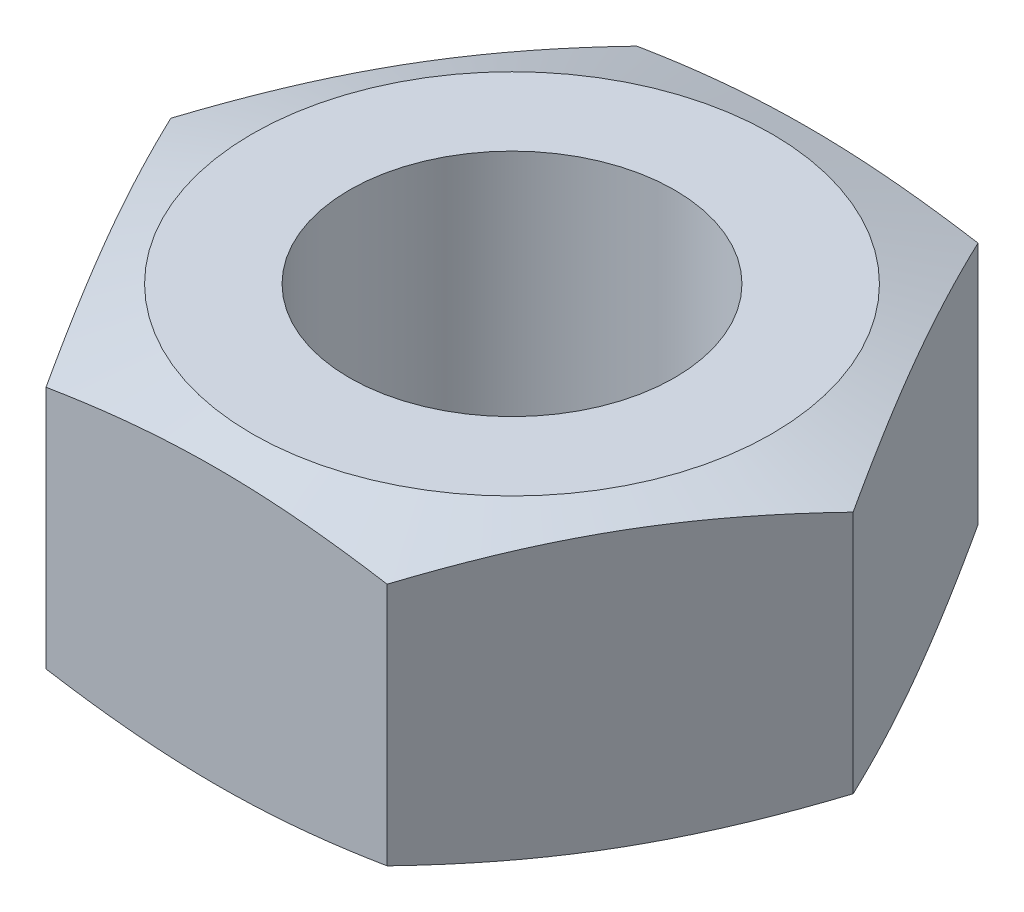
ISO-10303-21;
HEADER;
FILE_DESCRIPTION(('STEP AP214'),'2;1');
FILE_NAME('part.step','',(''),(''),'','','');
FILE_SCHEMA(('AUTOMOTIVE_DESIGN { 1 0 10303 214 1 1 1 1 }'));
ENDSEC;
DATA;
#1=APPLICATION_CONTEXT('core data for automotive mechanical design processes');
#2=APPLICATION_PROTOCOL_DEFINITION('international standard','automotive_design',2000,#1);
#3=PRODUCT_CONTEXT('',#1,'mechanical');
#4=PRODUCT('Part','Part','',(#3));
#5=PRODUCT_RELATED_PRODUCT_CATEGORY('part','',(#4));
#6=PRODUCT_DEFINITION_FORMATION('','',#4);
#7=PRODUCT_DEFINITION_CONTEXT('part definition',#1,'design');
#8=PRODUCT_DEFINITION('design','',#6,#7);
#9=PRODUCT_DEFINITION_SHAPE('','',#8);
#10=(LENGTH_UNIT() NAMED_UNIT(*) SI_UNIT(.MILLI.,.METRE.));
#11=(NAMED_UNIT(*) PLANE_ANGLE_UNIT() SI_UNIT($,.RADIAN.));
#12=(NAMED_UNIT(*) SI_UNIT($,.STERADIAN.) SOLID_ANGLE_UNIT());
#13=UNCERTAINTY_MEASURE_WITH_UNIT(LENGTH_MEASURE(1.E-05),#10,'distance_accuracy_value','');
#14=(GEOMETRIC_REPRESENTATION_CONTEXT(3) GLOBAL_UNCERTAINTY_ASSIGNED_CONTEXT((#13)) GLOBAL_UNIT_ASSIGNED_CONTEXT((#10,
#11,#12)) REPRESENTATION_CONTEXT('',''));
#15=CARTESIAN_POINT('',(0.,0.,0.));
#16=DIRECTION('',(0.,0.,1.));
#17=DIRECTION('',(1.,0.,0.));
#18=AXIS2_PLACEMENT_3D('',#15,#16,#17);
#19=CARTESIAN_POINT('',(0.,11.,0.));
#20=DIRECTION('',(0.,1.,0.));
#21=DIRECTION('',(0.,0.,1.));
#22=AXIS2_PLACEMENT_3D('',#19,#20,#21);
#23=PLANE('',#22);
#24=CARTESIAN_POINT('',(0.,11.,0.));
#25=DIRECTION('',(0.,1.,0.));
#26=DIRECTION('',(0.,0.,1.));
#27=AXIS2_PLACEMENT_3D('',#24,#25,#26);
#28=CIRCLE('',#27,6.);
#29=CARTESIAN_POINT('',(0.,11.,6.));
#30=VERTEX_POINT('',#29);
#31=EDGE_CURVE('E209',#30,#30,#28,.T.);
#32=ORIENTED_EDGE('',*,*,#31,.F.);
#33=EDGE_LOOP('',(#32));
#34=FACE_BOUND('',#33,.T.);
#35=CARTESIAN_POINT('',(0.,11.,0.));
#36=DIRECTION('',(0.,-1.,0.));
#37=DIRECTION('',(1.,0.,0.));
#38=AXIS2_PLACEMENT_3D('',#35,#36,#37);
#39=CIRCLE('',#38,9.58623586833384);
#40=CARTESIAN_POINT('',(9.58623586833384,11.,0.));
#41=VERTEX_POINT('',#40);
#42=EDGE_CURVE('E240',#41,#41,#39,.T.);
#43=ORIENTED_EDGE('',*,*,#42,.F.);
#44=EDGE_LOOP('',(#43));
#45=FACE_BOUND('',#44,.T.);
#46=ADVANCED_FACE('F43',(#34,#45),#23,.T.);
#47=CARTESIAN_POINT('',(0.,0.,0.));
#48=DIRECTION('',(0.,1.,0.));
#49=DIRECTION('',(0.,0.,1.));
#50=AXIS2_PLACEMENT_3D('',#47,#48,#49);
#51=PLANE('',#50);
#52=CARTESIAN_POINT('',(0.,0.,0.));
#53=DIRECTION('',(0.,1.,0.));
#54=DIRECTION('',(0.,0.,1.));
#55=AXIS2_PLACEMENT_3D('',#52,#53,#54);
#56=CIRCLE('',#55,6.);
#57=CARTESIAN_POINT('',(0.,0.,6.));
#58=VERTEX_POINT('',#57);
#59=EDGE_CURVE('E208',#58,#58,#56,.T.);
#60=ORIENTED_EDGE('',*,*,#59,.T.);
#61=EDGE_LOOP('',(#60));
#62=FACE_BOUND('',#61,.T.);
#63=CARTESIAN_POINT('',(0.,0.,0.));
#64=DIRECTION('',(0.,-1.,0.));
#65=DIRECTION('',(1.,0.,0.));
#66=AXIS2_PLACEMENT_3D('',#63,#64,#65);
#67=CIRCLE('',#66,9.58623586833384);
#68=CARTESIAN_POINT('',(9.58623586833384,0.,0.));
#69=VERTEX_POINT('',#68);
#70=EDGE_CURVE('E245',#69,#69,#67,.T.);
#71=ORIENTED_EDGE('',*,*,#70,.T.);
#72=EDGE_LOOP('',(#71));
#73=FACE_BOUND('',#72,.T.);
#74=ADVANCED_FACE('F253',(#62,#73),#51,.F.);
#75=CARTESIAN_POINT('',(0.,11.,0.));
#76=DIRECTION('',(0.,-1.,0.));
#77=DIRECTION('',(0.,0.,-1.));
#78=AXIS2_PLACEMENT_3D('',#75,#76,#77);
#79=CYLINDRICAL_SURFACE('',#78,6.);
#80=ORIENTED_EDGE('',*,*,#31,.T.);
#81=EDGE_LOOP('',(#80));
#82=FACE_BOUND('',#81,.T.);
#83=ORIENTED_EDGE('',*,*,#59,.F.);
#84=EDGE_LOOP('',(#83));
#85=FACE_BOUND('',#84,.T.);
#86=ADVANCED_FACE('F144',(#82,#85),#79,.F.);
#87=CARTESIAN_POINT('',(0.,1.,0.));
#88=DIRECTION('',(0.,1.,0.));
#89=DIRECTION('',(-1.,0.,0.));
#90=AXIS2_PLACEMENT_3D('',#87,#88,#89);
#91=CONICAL_SURFACE('',#90,12.5862358683338,1.24904577239825);
#92=ORIENTED_EDGE('',*,*,#70,.F.);
#93=EDGE_LOOP('',(#92));
#94=FACE_BOUND('',#93,.T.);
#95=CARTESIAN_POINT('',(-18.919217242071,4.08276532679469,10.9));
#96=CARTESIAN_POINT('',(-18.4589506404571,3.94984717953973,10.9));
#97=CARTESIAN_POINT('',(-17.9983687328802,3.81800964723407,10.9));
#98=CARTESIAN_POINT('',(-17.076439839604,3.55699448748095,10.9));
#99=CARTESIAN_POINT('',(-16.6150928349483,3.42781692703574,10.9));
#100=CARTESIAN_POINT('',(-15.6913777417623,3.17258714651741,10.9));
#101=CARTESIAN_POINT('',(-15.2290093785967,3.04653591835544,10.9));
#102=CARTESIAN_POINT('',(-14.3032462297036,2.79826266784021,10.9));
#103=CARTESIAN_POINT('',(-13.8398514491721,2.67604062614991,10.9));
#104=CARTESIAN_POINT('',(-12.9051989696044,2.43452524953806,10.9));
#105=CARTESIAN_POINT('',(-12.4339238589094,2.31529910723409,10.9));
#106=CARTESIAN_POINT('',(-11.4899214244642,2.08271057594021,10.9));
#107=CARTESIAN_POINT('',(-11.0171940942595,1.96934821305247,10.9));
#108=CARTESIAN_POINT('',(-10.0699758063428,1.74982696476706,10.9));
#109=CARTESIAN_POINT('',(-9.5954845574452,1.64366932998787,10.9));
#110=CARTESIAN_POINT('',(-8.64458354730637,1.44026905012124,10.9));
#111=CARTESIAN_POINT('',(-8.16817378998942,1.34302638680803,10.9));
#112=CARTESIAN_POINT('',(-7.23260989374876,1.16323963160623,10.9));
#113=CARTESIAN_POINT('',(-6.77354021605027,1.08025914976256,10.9));
#114=CARTESIAN_POINT('',(-5.85333852890243,0.926522859013812,10.9));
#115=CARTESIAN_POINT('',(-5.39220652046268,0.855767044124905,10.9));
#116=CARTESIAN_POINT('',(-4.46813362729067,0.7288317608574,10.9));
#117=CARTESIAN_POINT('',(-4.00519367802006,0.672645564642882,10.9));
#118=CARTESIAN_POINT('',(-3.07756502953399,0.577105478969232,10.9));
#119=CARTESIAN_POINT('',(-2.61287637143147,0.537751196247739,10.9));
#120=CARTESIAN_POINT('',(-1.6853684622957,0.477990278850487,10.9));
#121=CARTESIAN_POINT('',(-1.2225573586355,0.457459257804081,10.9));
#122=CARTESIAN_POINT('',(-0.29647557393164,0.436003274470962,10.9));
#123=CARTESIAN_POINT('',(0.166795104362727,0.435078195595219,10.9));
#124=CARTESIAN_POINT('',(1.09302911650978,0.45288867259324,10.9));
#125=CARTESIAN_POINT('',(1.55599238723999,0.471627463868099,10.9));
#126=CARTESIAN_POINT('',(2.48076270564126,0.527747776838758,10.9));
#127=CARTESIAN_POINT('',(2.94256975312858,0.565129301496959,10.9));
#128=CARTESIAN_POINT('',(4.05259712498179,0.675416114559827,10.9));
#129=CARTESIAN_POINT('',(4.69999378869316,0.756592579363781,10.9));
#130=CARTESIAN_POINT('',(5.99064749385318,0.945995171429053,10.9));
#131=CARTESIAN_POINT('',(6.63390487928599,1.05421902041397,10.9));
#132=CARTESIAN_POINT('',(7.91957578252446,1.29213047201542,10.9));
#133=CARTESIAN_POINT('',(8.56197043052029,1.42191860308361,10.9));
#134=CARTESIAN_POINT('',(9.84328615352082,1.69744774989799,10.9));
#135=CARTESIAN_POINT('',(10.4822072423368,1.8431887021649,10.9));
#136=CARTESIAN_POINT('',(11.7769945204418,2.15140384071238,10.9));
#137=CARTESIAN_POINT('',(12.4327697261156,2.31425747027189,10.9));
#138=CARTESIAN_POINT('',(13.7418584528716,2.64956113498316,10.9));
#139=CARTESIAN_POINT('',(14.3951719352256,2.82201132044174,10.9));
#140=CARTESIAN_POINT('',(15.6945114428467,3.17277036692123,10.9));
#141=CARTESIAN_POINT('',(16.3405534888535,3.35102008372361,10.9));
#142=CARTESIAN_POINT('',(17.3084133499972,3.62254610426766,10.9));
#143=CARTESIAN_POINT('',(17.6308174030917,3.71374223165522,10.9));
#144=CARTESIAN_POINT('',(18.275272039208,3.89736729022585,10.9));
#145=CARTESIAN_POINT('',(18.5973226245603,3.98979621322753,10.9));
#146=CARTESIAN_POINT('',(18.919217242071,4.0827653267947,10.9));
#147=B_SPLINE_CURVE_WITH_KNOTS('',3,(#95,#96,#97,#98,#99,#100,#101,#102,#103,#104,#105,#106,
#107,#108,#109,#110,#111,#112,#113,#114,#115,#116,#117,#118,#119,#120,#121,#122,#123,#124,#125,
#126,#127,#128,#129,#130,#131,#132,#133,#134,#135,#136,#137,#138,#139,#140,#141,#142,#143,#144,
#145,#146),.UNSPECIFIED.,.F.,.F.,(4,2,2,2,2,2,2,2,2,2,2,2,2,2,2,2,2,2,2,2,2,2,2,2,2,4),(0.,
1.43722745819694,2.87449107465905,4.31220501375794,5.74991169136189,7.208248880608,
8.66659256097754,10.1251887410029,11.5837819390089,12.9831736458271,14.3825646676564,
15.7813083350872,17.180019320358,18.5694193987653,19.95881121494,21.3484316709859,
22.7380523478478,24.6946822567533,26.6511474087947,28.6170032019543,30.5828511728878,
32.6098374791142,34.6368555421143,36.6473671014288,37.6525268935128,38.6576800182118),.UNSPECIFIED.);
#148=CARTESIAN_POINT('',(-6.29311793416691,1.,10.9));
#149=VERTEX_POINT('',#148);
#150=CARTESIAN_POINT('',(6.29311793416692,1.,10.9));
#151=VERTEX_POINT('',#150);
#152=EDGE_CURVE('E59',#149,#151,#147,.T.);
#153=ORIENTED_EDGE('',*,*,#152,.F.);
#154=CARTESIAN_POINT('',(-12.5863513383877,1.00003849054762,-0.000199999999999828));
#155=CARTESIAN_POINT('',(-12.3254760059926,0.913047455202333,0.451649330149653));
#156=CARTESIAN_POINT('',(-12.0638754942636,0.833970138061345,0.904754707750272));
#157=CARTESIAN_POINT('',(-11.5392467823649,0.694913823576884,1.81343829186827));
#158=CARTESIAN_POINT('',(-11.2762177703598,0.634947174178273,2.26901790452573));
#159=CARTESIAN_POINT('',(-10.7511871545147,0.537891199124896,3.1783976066986));
#160=CARTESIAN_POINT('',(-10.4891940088837,0.500623774801604,3.6321830461663));
#161=CARTESIAN_POINT('',(-9.96469275299856,0.450642659982756,4.54064586999311));
#162=CARTESIAN_POINT('',(-9.70218482712447,0.437921377222055,4.99532293499655));
#163=CARTESIAN_POINT('',(-9.1771689753763,0.437921377222055,5.90467706500345));
#164=CARTESIAN_POINT('',(-8.91466104950221,0.450642659982757,6.35935413000689));
#165=CARTESIAN_POINT('',(-8.39015979361703,0.500623774801605,7.2678169538337));
#166=CARTESIAN_POINT('',(-8.12816664798602,0.537891199124896,7.7216023933014));
#167=CARTESIAN_POINT('',(-7.60313603214093,0.634947174178274,8.63098209547428));
#168=CARTESIAN_POINT('',(-7.34010702013584,0.694913823576885,9.08656170813174));
#169=CARTESIAN_POINT('',(-6.81547830823712,0.833970138061346,9.99524529224973));
#170=CARTESIAN_POINT('',(-6.55387779650814,0.913047455202335,10.4483506698504));
#171=CARTESIAN_POINT('',(-6.29300246411309,1.00003849054762,10.9002));
#172=B_SPLINE_CURVE_WITH_KNOTS('',3,(#154,#155,#156,#157,#158,#159,#160,#161,#162,#163,#164,
#165,#166,#167,#168,#169,#170,#171),.UNSPECIFIED.,.F.,.F.,(4,2,2,2,2,2,2,2,4),(0.,
1.58699307187652,3.17500947577589,4.75040013614414,6.32530344080708,7.90020674547001,
9.47559740583826,11.0636138097376,12.6506068816142),.UNSPECIFIED.);
#173=CARTESIAN_POINT('',(-12.5862358683338,0.999999999999999,0.));
#174=VERTEX_POINT('',#173);
#175=EDGE_CURVE('E153',#174,#149,#172,.T.);
#176=ORIENTED_EDGE('',*,*,#175,.F.);
#177=CARTESIAN_POINT('',(-6.29300246411309,1.00003849054762,-10.9002));
#178=CARTESIAN_POINT('',(-6.55387779650814,0.913047455202336,-10.4483506698504));
#179=CARTESIAN_POINT('',(-6.81547830823712,0.833970138061347,-9.99524529224974));
#180=CARTESIAN_POINT('',(-7.34010702013584,0.694913823576886,-9.08656170813174));
#181=CARTESIAN_POINT('',(-7.60313603214093,0.634947174178275,-8.63098209547428));
#182=CARTESIAN_POINT('',(-8.12816664798602,0.537891199124897,-7.7216023933014));
#183=CARTESIAN_POINT('',(-8.39015979361703,0.500623774801605,-7.2678169538337));
#184=CARTESIAN_POINT('',(-8.91466104950221,0.450642659982757,-6.3593541300069));
#185=CARTESIAN_POINT('',(-9.1771689753763,0.437921377222055,-5.90467706500345));
#186=CARTESIAN_POINT('',(-9.70218482712447,0.437921377222055,-4.99532293499656));
#187=CARTESIAN_POINT('',(-9.96469275299856,0.450642659982757,-4.54064586999311));
#188=CARTESIAN_POINT('',(-10.4891940088837,0.500623774801605,-3.63218304616631));
#189=CARTESIAN_POINT('',(-10.7511871545147,0.537891199124896,-3.1783976066986));
#190=CARTESIAN_POINT('',(-11.2762177703598,0.634947174178274,-2.26901790452573));
#191=CARTESIAN_POINT('',(-11.5392467823649,0.694913823576885,-1.81343829186827));
#192=CARTESIAN_POINT('',(-12.0638754942636,0.833970138061345,-0.904754707750269));
#193=CARTESIAN_POINT('',(-12.3254760059926,0.913047455202334,-0.451649330149649));
#194=CARTESIAN_POINT('',(-12.5863513383877,1.00003849054762,0.000200000000002275));
#195=B_SPLINE_CURVE_WITH_KNOTS('',3,(#177,#178,#179,#180,#181,#182,#183,#184,#185,#186,#187,
#188,#189,#190,#191,#192,#193,#194),.UNSPECIFIED.,.F.,.F.,(4,2,2,2,2,2,2,2,4),(0.,
1.58699307187652,3.17500947577589,4.75040013614414,6.32530344080708,7.90020674547002,
9.47559740583826,11.0636138097376,12.6506068816142),.UNSPECIFIED.);
#196=CARTESIAN_POINT('',(-6.29311793416694,1.,-10.9));
#197=VERTEX_POINT('',#196);
#198=EDGE_CURVE('E161',#197,#174,#195,.T.);
#199=ORIENTED_EDGE('',*,*,#198,.F.);
#200=CARTESIAN_POINT('',(18.919217242071,4.08276532679469,-10.9));
#201=CARTESIAN_POINT('',(18.4589506404571,3.94984717953973,-10.9));
#202=CARTESIAN_POINT('',(17.9983687328802,3.81800964723407,-10.9));
#203=CARTESIAN_POINT('',(17.076439839604,3.55699448748095,-10.9));
#204=CARTESIAN_POINT('',(16.6150928349482,3.42781692703575,-10.9));
#205=CARTESIAN_POINT('',(15.6913777417623,3.17258714651742,-10.9));
#206=CARTESIAN_POINT('',(15.2290093785966,3.04653591835544,-10.9));
#207=CARTESIAN_POINT('',(14.3032462297036,2.79826266784021,-10.9));
#208=CARTESIAN_POINT('',(13.8398514491721,2.67604062614991,-10.9));
#209=CARTESIAN_POINT('',(12.9051989696044,2.43452524953806,-10.9));
#210=CARTESIAN_POINT('',(12.4339238589094,2.31529910723409,-10.9));
#211=CARTESIAN_POINT('',(11.4899214244642,2.08271057594021,-10.9));
#212=CARTESIAN_POINT('',(11.0171940942595,1.96934821305248,-10.9));
#213=CARTESIAN_POINT('',(10.0699758063428,1.74982696476706,-10.9));
#214=CARTESIAN_POINT('',(9.5954845574452,1.64366932998787,-10.9));
#215=CARTESIAN_POINT('',(8.64458354730636,1.44026905012124,-10.9));
#216=CARTESIAN_POINT('',(8.16817378998941,1.34302638680803,-10.9));
#217=CARTESIAN_POINT('',(7.23260989374875,1.16323963160624,-10.9));
#218=CARTESIAN_POINT('',(6.77354021605026,1.08025914976256,-10.9));
#219=CARTESIAN_POINT('',(5.85333852890242,0.926522859013814,-10.9));
#220=CARTESIAN_POINT('',(5.39220652046267,0.855767044124907,-10.9));
#221=CARTESIAN_POINT('',(4.46813362729067,0.728831760857402,-10.9));
#222=CARTESIAN_POINT('',(4.00519367802005,0.672645564642883,-10.9));
#223=CARTESIAN_POINT('',(3.07756502953399,0.577105478969232,-10.9));
#224=CARTESIAN_POINT('',(2.61287637143147,0.53775119624774,-10.9));
#225=CARTESIAN_POINT('',(1.6853684622957,0.477990278850488,-10.9));
#226=CARTESIAN_POINT('',(1.2225573586355,0.457459257804082,-10.9));
#227=CARTESIAN_POINT('',(0.296475573931636,0.436003274470963,-10.9));
#228=CARTESIAN_POINT('',(-0.16679510436273,0.435078195595219,-10.9));
#229=CARTESIAN_POINT('',(-1.09302911650979,0.45288867259324,-10.9));
#230=CARTESIAN_POINT('',(-1.55599238723999,0.471627463868098,-10.9));
#231=CARTESIAN_POINT('',(-2.48076270564126,0.527747776838757,-10.9));
#232=CARTESIAN_POINT('',(-2.94256975312859,0.565129301496958,-10.9));
#233=CARTESIAN_POINT('',(-4.05259712498179,0.675416114559826,-10.9));
#234=CARTESIAN_POINT('',(-4.69999378869316,0.75659257936378,-10.9));
#235=CARTESIAN_POINT('',(-5.99064749385318,0.945995171429051,-10.9));
#236=CARTESIAN_POINT('',(-6.63390487928599,1.05421902041397,-10.9));
#237=CARTESIAN_POINT('',(-7.91957578252446,1.29213047201542,-10.9));
#238=CARTESIAN_POINT('',(-8.56197043052029,1.42191860308361,-10.9));
#239=CARTESIAN_POINT('',(-9.84328615352082,1.69744774989799,-10.9));
#240=CARTESIAN_POINT('',(-10.4822072423368,1.8431887021649,-10.9));
#241=CARTESIAN_POINT('',(-11.7769945204418,2.15140384071238,-10.9));
#242=CARTESIAN_POINT('',(-12.4327697261156,2.31425747027189,-10.9));
#243=CARTESIAN_POINT('',(-13.7418584528716,2.64956113498315,-10.9));
#244=CARTESIAN_POINT('',(-14.3951719352256,2.82201132044173,-10.9));
#245=CARTESIAN_POINT('',(-15.6945114428467,3.17277036692122,-10.9));
#246=CARTESIAN_POINT('',(-16.3405534888535,3.3510200837236,-10.9));
#247=CARTESIAN_POINT('',(-17.3084133499972,3.62254610426766,-10.9));
#248=CARTESIAN_POINT('',(-17.6308174030917,3.71374223165521,-10.9));
#249=CARTESIAN_POINT('',(-18.275272039208,3.89736729022585,-10.9));
#250=CARTESIAN_POINT('',(-18.5973226245603,3.98979621322752,-10.9));
#251=CARTESIAN_POINT('',(-18.919217242071,4.08276532679469,-10.9));
#252=B_SPLINE_CURVE_WITH_KNOTS('',3,(#200,#201,#202,#203,#204,#205,#206,#207,#208,#209,#210,
#211,#212,#213,#214,#215,#216,#217,#218,#219,#220,#221,#222,#223,#224,#225,#226,#227,#228,#229,
#230,#231,#232,#233,#234,#235,#236,#237,#238,#239,#240,#241,#242,#243,#244,#245,#246,#247,#248,
#249,#250,#251),.UNSPECIFIED.,.F.,.F.,(4,2,2,2,2,2,2,2,2,2,2,2,2,2,2,2,2,2,2,2,2,2,2,2,2,4),(0.,
1.43722745819694,2.87449107465904,4.31220501375793,5.74991169136188,7.20824888060799,
8.66659256097753,10.1251887410029,11.5837819390089,12.9831736458271,14.3825646676564,
15.7813083350872,17.180019320358,18.5694193987653,19.95881121494,21.3484316709859,
22.7380523478478,24.6946822567533,26.6511474087947,28.6170032019543,30.5828511728877,
32.6098374791141,34.6368555421143,36.6473671014288,37.6525268935128,38.6576800182118),.UNSPECIFIED.);
#253=CARTESIAN_POINT('',(6.2931179341669,1.,-10.9));
#254=VERTEX_POINT('',#253);
#255=EDGE_CURVE('E104',#254,#197,#252,.T.);
#256=ORIENTED_EDGE('',*,*,#255,.F.);
#257=CARTESIAN_POINT('',(12.5863513383877,1.00003849054762,0.00019999999999488));
#258=CARTESIAN_POINT('',(12.3254760059926,0.913047455202335,-0.451649330149658));
#259=CARTESIAN_POINT('',(12.0638754942636,0.833970138061346,-0.904754707750277));
#260=CARTESIAN_POINT('',(11.5392467823649,0.694913823576886,-1.81343829186827));
#261=CARTESIAN_POINT('',(11.2762177703598,0.634947174178275,-2.26901790452573));
#262=CARTESIAN_POINT('',(10.7511871545147,0.537891199124898,-3.17839760669861));
#263=CARTESIAN_POINT('',(10.4891940088837,0.500623774801606,-3.63218304616631));
#264=CARTESIAN_POINT('',(9.96469275299856,0.450642659982758,-4.54064586999311));
#265=CARTESIAN_POINT('',(9.70218482712447,0.437921377222056,-4.99532293499656));
#266=CARTESIAN_POINT('',(9.17716897537629,0.437921377222056,-5.90467706500345));
#267=CARTESIAN_POINT('',(8.9146610495022,0.450642659982758,-6.3593541300069));
#268=CARTESIAN_POINT('',(8.39015979361703,0.500623774801606,-7.2678169538337));
#269=CARTESIAN_POINT('',(8.12816664798602,0.537891199124898,-7.7216023933014));
#270=CARTESIAN_POINT('',(7.60313603214092,0.634947174178276,-8.63098209547428));
#271=CARTESIAN_POINT('',(7.34010702013583,0.694913823576886,-9.08656170813174));
#272=CARTESIAN_POINT('',(6.81547830823711,0.833970138061347,-9.99524529224973));
#273=CARTESIAN_POINT('',(6.55387779650813,0.913047455202335,-10.4483506698504));
#274=CARTESIAN_POINT('',(6.29300246411307,1.00003849054762,-10.9002));
#275=B_SPLINE_CURVE_WITH_KNOTS('',3,(#257,#258,#259,#260,#261,#262,#263,#264,#265,#266,#267,
#268,#269,#270,#271,#272,#273,#274),.UNSPECIFIED.,.F.,.F.,(4,2,2,2,2,2,2,2,4),(0.,
1.58699307187652,3.17500947577589,4.75040013614414,6.32530344080708,7.90020674547001,
9.47559740583826,11.0636138097376,12.6506068816142),.UNSPECIFIED.);
#276=CARTESIAN_POINT('',(12.5862358683338,1.,0.));
#277=VERTEX_POINT('',#276);
#278=EDGE_CURVE('E101',#277,#254,#275,.T.);
#279=ORIENTED_EDGE('',*,*,#278,.F.);
#280=CARTESIAN_POINT('',(6.29300246411308,1.00003849054762,10.9002));
#281=CARTESIAN_POINT('',(6.55387779650813,0.913047455202336,10.4483506698504));
#282=CARTESIAN_POINT('',(6.81547830823712,0.833970138061348,9.99524529224973));
#283=CARTESIAN_POINT('',(7.34010702013584,0.694913823576887,9.08656170813174));
#284=CARTESIAN_POINT('',(7.60313603214093,0.634947174178276,8.63098209547428));
#285=CARTESIAN_POINT('',(8.12816664798602,0.537891199124898,7.7216023933014));
#286=CARTESIAN_POINT('',(8.39015979361703,0.500623774801606,7.2678169538337));
#287=CARTESIAN_POINT('',(8.9146610495022,0.450642659982758,6.35935413000689));
#288=CARTESIAN_POINT('',(9.17716897537629,0.437921377222056,5.90467706500345));
#289=CARTESIAN_POINT('',(9.70218482712447,0.437921377222056,4.99532293499655));
#290=CARTESIAN_POINT('',(9.96469275299856,0.450642659982757,4.54064586999311));
#291=CARTESIAN_POINT('',(10.4891940088837,0.500623774801605,3.6321830461663));
#292=CARTESIAN_POINT('',(10.7511871545147,0.537891199124897,3.1783976066986));
#293=CARTESIAN_POINT('',(11.2762177703598,0.634947174178275,2.26901790452572));
#294=CARTESIAN_POINT('',(11.5392467823649,0.694913823576886,1.81343829186826));
#295=CARTESIAN_POINT('',(12.0638754942636,0.833970138061347,0.904754707750266));
#296=CARTESIAN_POINT('',(12.3254760059926,0.913047455202336,0.451649330149646));
#297=CARTESIAN_POINT('',(12.5863513383877,1.00003849054762,-0.000200000000005913));
#298=B_SPLINE_CURVE_WITH_KNOTS('',3,(#280,#281,#282,#283,#284,#285,#286,#287,#288,#289,#290,
#291,#292,#293,#294,#295,#296,#297),.UNSPECIFIED.,.F.,.F.,(4,2,2,2,2,2,2,2,4),(0.,
1.58699307187653,3.17500947577589,4.75040013614414,6.32530344080708,7.90020674547002,
9.47559740583826,11.0636138097376,12.6506068816142),.UNSPECIFIED.);
#299=EDGE_CURVE('E73',#151,#277,#298,.T.);
#300=ORIENTED_EDGE('',*,*,#299,.F.);
#301=EDGE_LOOP('',(#153,#176,#199,#256,#279,#300));
#302=FACE_BOUND('',#301,.T.);
#303=ADVANCED_FACE('F102',(#94,#302),#91,.T.);
#304=CARTESIAN_POINT('',(0.,11.,0.));
#305=DIRECTION('',(0.,-1.,0.));
#306=DIRECTION('',(1.,0.,0.));
#307=AXIS2_PLACEMENT_3D('',#304,#305,#306);
#308=CONICAL_SURFACE('',#307,9.58623586833384,1.24904577239825);
#309=ORIENTED_EDGE('',*,*,#42,.T.);
#310=EDGE_LOOP('',(#309));
#311=FACE_BOUND('',#310,.T.);
#312=CARTESIAN_POINT('',(6.29300246411308,9.99996150945238,-10.9002));
#313=CARTESIAN_POINT('',(6.55387779650813,10.0869525447977,-10.4483506698504));
#314=CARTESIAN_POINT('',(6.81547830823711,10.1660298619387,-9.99524529224974));
#315=CARTESIAN_POINT('',(7.34010702013583,10.3050861764231,-9.08656170813174));
#316=CARTESIAN_POINT('',(7.60313603214092,10.3650528258217,-8.63098209547428));
#317=CARTESIAN_POINT('',(8.12816664798602,10.4621088008751,-7.7216023933014));
#318=CARTESIAN_POINT('',(8.39015979361703,10.4993762251984,-7.2678169538337));
#319=CARTESIAN_POINT('',(8.9146610495022,10.5493573400172,-6.3593541300069));
#320=CARTESIAN_POINT('',(9.17716897537629,10.5620786227779,-5.90467706500345));
#321=CARTESIAN_POINT('',(9.70218482712447,10.5620786227779,-4.99532293499656));
#322=CARTESIAN_POINT('',(9.96469275299856,10.5493573400172,-4.54064586999311));
#323=CARTESIAN_POINT('',(10.4891940088837,10.4993762251984,-3.63218304616631));
#324=CARTESIAN_POINT('',(10.7511871545147,10.4621088008751,-3.17839760669861));
#325=CARTESIAN_POINT('',(11.2762177703598,10.3650528258217,-2.26901790452573));
#326=CARTESIAN_POINT('',(11.5392467823649,10.3050861764231,-1.81343829186827));
#327=CARTESIAN_POINT('',(12.0638754942636,10.1660298619387,-0.904754707750276));
#328=CARTESIAN_POINT('',(12.3254760059926,10.0869525447977,-0.451649330149657));
#329=CARTESIAN_POINT('',(12.5863513383877,9.99996150945238,0.000199999999994992));
#330=B_SPLINE_CURVE_WITH_KNOTS('',3,(#312,#313,#314,#315,#316,#317,#318,#319,#320,#321,#322,
#323,#324,#325,#326,#327,#328,#329),.UNSPECIFIED.,.F.,.F.,(4,2,2,2,2,2,2,2,4),(0.,
1.58699307187652,3.17500947577589,4.75040013614414,6.32530344080708,7.90020674547002,
9.47559740583826,11.0636138097376,12.6506068816142),.UNSPECIFIED.);
#331=CARTESIAN_POINT('',(6.2931179341669,10.,-10.9));
#332=VERTEX_POINT('',#331);
#333=CARTESIAN_POINT('',(12.5862358683338,10.,0.));
#334=VERTEX_POINT('',#333);
#335=EDGE_CURVE('E122',#332,#334,#330,.T.);
#336=ORIENTED_EDGE('',*,*,#335,.F.);
#337=CARTESIAN_POINT('',(-18.919217242071,6.9172346732053,-10.9));
#338=CARTESIAN_POINT('',(-18.4589506404571,7.05015282046027,-10.9));
#339=CARTESIAN_POINT('',(-17.9983687328802,7.18199035276593,-10.9));
#340=CARTESIAN_POINT('',(-17.076439839604,7.44300551251905,-10.9));
#341=CARTESIAN_POINT('',(-16.6150928349483,7.57218307296425,-10.9));
#342=CARTESIAN_POINT('',(-15.6913777417623,7.82741285348258,-10.9));
#343=CARTESIAN_POINT('',(-15.2290093785967,7.95346408164456,-10.9));
#344=CARTESIAN_POINT('',(-14.3032462297036,8.20173733215979,-10.9));
#345=CARTESIAN_POINT('',(-13.8398514491721,8.32395937385009,-10.9));
#346=CARTESIAN_POINT('',(-12.9051989696044,8.56547475046194,-10.9));
#347=CARTESIAN_POINT('',(-12.4339238589094,8.68470089276591,-10.9));
#348=CARTESIAN_POINT('',(-11.4899214244642,8.91728942405979,-10.9));
#349=CARTESIAN_POINT('',(-11.0171940942596,9.03065178694752,-10.9));
#350=CARTESIAN_POINT('',(-10.0699758063428,9.25017303523294,-10.9));
#351=CARTESIAN_POINT('',(-9.59548455744521,9.35633067001213,-10.9));
#352=CARTESIAN_POINT('',(-8.64458354730637,9.55973094987876,-10.9));
#353=CARTESIAN_POINT('',(-8.16817378998942,9.65697361319197,-10.9));
#354=CARTESIAN_POINT('',(-7.23260989374876,9.83676036839377,-10.9));
#355=CARTESIAN_POINT('',(-6.77354021605027,9.91974085023744,-10.9));
#356=CARTESIAN_POINT('',(-5.85333852890243,10.0734771409862,-10.9));
#357=CARTESIAN_POINT('',(-5.39220652046268,10.1442329558751,-10.9));
#358=CARTESIAN_POINT('',(-4.46813362729067,10.2711682391426,-10.9));
#359=CARTESIAN_POINT('',(-4.00519367802005,10.3273544353571,-10.9));
#360=CARTESIAN_POINT('',(-3.07756502953399,10.4228945210308,-10.9));
#361=CARTESIAN_POINT('',(-2.61287637143147,10.4622488037523,-10.9));
#362=CARTESIAN_POINT('',(-1.6853684622957,10.5220097211495,-10.9));
#363=CARTESIAN_POINT('',(-1.2225573586355,10.5425407421959,-10.9));
#364=CARTESIAN_POINT('',(-0.296475573931641,10.563996725529,-10.9));
#365=CARTESIAN_POINT('',(0.166795104362725,10.5649218044048,-10.9));
#366=CARTESIAN_POINT('',(1.09302911650978,10.5471113274068,-10.9));
#367=CARTESIAN_POINT('',(1.55599238723999,10.5283725361319,-10.9));
#368=CARTESIAN_POINT('',(2.48076270564126,10.4722522231612,-10.9));
#369=CARTESIAN_POINT('',(2.94256975312858,10.434870698503,-10.9));
#370=CARTESIAN_POINT('',(4.05259712498179,10.3245838854402,-10.9));
#371=CARTESIAN_POINT('',(4.69999378869316,10.2434074206362,-10.9));
#372=CARTESIAN_POINT('',(5.99064749385318,10.054004828571,-10.9));
#373=CARTESIAN_POINT('',(6.63390487928598,9.94578097958603,-10.9));
#374=CARTESIAN_POINT('',(7.91957578252445,9.70786952798458,-10.9));
#375=CARTESIAN_POINT('',(8.56197043052028,9.5780813969164,-10.9));
#376=CARTESIAN_POINT('',(9.84328615352081,9.30255225010202,-10.9));
#377=CARTESIAN_POINT('',(10.4822072423368,9.15681129783511,-10.9));
#378=CARTESIAN_POINT('',(11.7769945204418,8.84859615928763,-10.9));
#379=CARTESIAN_POINT('',(12.4327697261156,8.68574252972812,-10.9));
#380=CARTESIAN_POINT('',(13.7418584528716,8.35043886501685,-10.9));
#381=CARTESIAN_POINT('',(14.3951719352256,8.17798867955827,-10.9));
#382=CARTESIAN_POINT('',(15.6945114428467,7.82722963307878,-10.9));
#383=CARTESIAN_POINT('',(16.3405534888535,7.64897991627641,-10.9));
#384=CARTESIAN_POINT('',(17.3084133499972,7.37745389573235,-10.9));
#385=CARTESIAN_POINT('',(17.6308174030917,7.28625776834479,-10.9));
#386=CARTESIAN_POINT('',(18.275272039208,7.10263270977416,-10.9));
#387=CARTESIAN_POINT('',(18.5973226245603,7.01020378677248,-10.9));
#388=CARTESIAN_POINT('',(18.919217242071,6.91723467320531,-10.9));
#389=B_SPLINE_CURVE_WITH_KNOTS('',3,(#337,#338,#339,#340,#341,#342,#343,#344,#345,#346,#347,
#348,#349,#350,#351,#352,#353,#354,#355,#356,#357,#358,#359,#360,#361,#362,#363,#364,#365,#366,
#367,#368,#369,#370,#371,#372,#373,#374,#375,#376,#377,#378,#379,#380,#381,#382,#383,#384,#385,
#386,#387,#388),.UNSPECIFIED.,.F.,.F.,(4,2,2,2,2,2,2,2,2,2,2,2,2,2,2,2,2,2,2,2,2,2,2,2,2,4),(0.,
1.43722745819694,2.87449107465904,4.31220501375793,5.74991169136188,7.20824888060799,
8.66659256097753,10.1251887410029,11.5837819390089,12.9831736458271,14.3825646676564,
15.7813083350872,17.180019320358,18.5694193987653,19.95881121494,21.3484316709859,
22.7380523478478,24.6946822567533,26.6511474087947,28.6170032019542,30.5828511728877,
32.6098374791141,34.6368555421143,36.6473671014288,37.6525268935127,38.6576800182118),.UNSPECIFIED.);
#390=CARTESIAN_POINT('',(-6.29311793416693,10.,-10.9));
#391=VERTEX_POINT('',#390);
#392=EDGE_CURVE('E196',#391,#332,#389,.T.);
#393=ORIENTED_EDGE('',*,*,#392,.F.);
#394=CARTESIAN_POINT('',(-12.5863513383877,9.99996150945238,0.000200000000000215));
#395=CARTESIAN_POINT('',(-12.3254760059926,10.0869525447977,-0.451649330149652));
#396=CARTESIAN_POINT('',(-12.0638754942636,10.1660298619387,-0.904754707750272));
#397=CARTESIAN_POINT('',(-11.5392467823649,10.3050861764231,-1.81343829186827));
#398=CARTESIAN_POINT('',(-11.2762177703598,10.3650528258217,-2.26901790452573));
#399=CARTESIAN_POINT('',(-10.7511871545147,10.4621088008751,-3.1783976066986));
#400=CARTESIAN_POINT('',(-10.4891940088837,10.4993762251984,-3.63218304616631));
#401=CARTESIAN_POINT('',(-9.96469275299856,10.5493573400172,-4.54064586999311));
#402=CARTESIAN_POINT('',(-9.70218482712447,10.5620786227779,-4.99532293499656));
#403=CARTESIAN_POINT('',(-9.1771689753763,10.5620786227779,-5.90467706500345));
#404=CARTESIAN_POINT('',(-8.91466104950221,10.5493573400172,-6.3593541300069));
#405=CARTESIAN_POINT('',(-8.39015979361703,10.4993762251984,-7.2678169538337));
#406=CARTESIAN_POINT('',(-8.12816664798602,10.4621088008751,-7.7216023933014));
#407=CARTESIAN_POINT('',(-7.60313603214093,10.3650528258217,-8.63098209547428));
#408=CARTESIAN_POINT('',(-7.34010702013584,10.3050861764231,-9.08656170813174));
#409=CARTESIAN_POINT('',(-6.81547830823712,10.1660298619387,-9.99524529224974));
#410=CARTESIAN_POINT('',(-6.55387779650814,10.0869525447977,-10.4483506698504));
#411=CARTESIAN_POINT('',(-6.29300246411308,9.99996150945238,-10.9002));
#412=B_SPLINE_CURVE_WITH_KNOTS('',3,(#394,#395,#396,#397,#398,#399,#400,#401,#402,#403,#404,
#405,#406,#407,#408,#409,#410,#411),.UNSPECIFIED.,.F.,.F.,(4,2,2,2,2,2,2,2,4),(0.,
1.58699307187653,3.17500947577589,4.75040013614414,6.32530344080708,7.90020674547002,
9.47559740583826,11.0636138097376,12.6506068816142),.UNSPECIFIED.);
#413=CARTESIAN_POINT('',(-12.5862358683338,10.,0.));
#414=VERTEX_POINT('',#413);
#415=EDGE_CURVE('E233',#414,#391,#412,.T.);
#416=ORIENTED_EDGE('',*,*,#415,.F.);
#417=CARTESIAN_POINT('',(-6.29300246411309,9.99996150945238,10.9002));
#418=CARTESIAN_POINT('',(-6.55387779650814,10.0869525447977,10.4483506698504));
#419=CARTESIAN_POINT('',(-6.81547830823712,10.1660298619387,9.99524529224973));
#420=CARTESIAN_POINT('',(-7.34010702013584,10.3050861764231,9.08656170813174));
#421=CARTESIAN_POINT('',(-7.60313603214093,10.3650528258217,8.63098209547428));
#422=CARTESIAN_POINT('',(-8.12816664798602,10.4621088008751,7.7216023933014));
#423=CARTESIAN_POINT('',(-8.39015979361703,10.4993762251984,7.2678169538337));
#424=CARTESIAN_POINT('',(-8.91466104950221,10.5493573400172,6.3593541300069));
#425=CARTESIAN_POINT('',(-9.1771689753763,10.5620786227779,5.90467706500345));
#426=CARTESIAN_POINT('',(-9.70218482712447,10.5620786227779,4.99532293499656));
#427=CARTESIAN_POINT('',(-9.96469275299856,10.5493573400172,4.54064586999311));
#428=CARTESIAN_POINT('',(-10.4891940088837,10.4993762251984,3.63218304616631));
#429=CARTESIAN_POINT('',(-10.7511871545147,10.4621088008751,3.17839760669861));
#430=CARTESIAN_POINT('',(-11.2762177703598,10.3650528258217,2.26901790452573));
#431=CARTESIAN_POINT('',(-11.5392467823649,10.3050861764231,1.81343829186827));
#432=CARTESIAN_POINT('',(-12.0638754942636,10.1660298619387,0.904754707750272));
#433=CARTESIAN_POINT('',(-12.3254760059926,10.0869525447977,0.451649330149653));
#434=CARTESIAN_POINT('',(-12.5863513383877,9.99996150945238,-0.000199999999997504));
#435=B_SPLINE_CURVE_WITH_KNOTS('',3,(#417,#418,#419,#420,#421,#422,#423,#424,#425,#426,#427,
#428,#429,#430,#431,#432,#433,#434),.UNSPECIFIED.,.F.,.F.,(4,2,2,2,2,2,2,2,4),(0.,
1.58699307187652,3.17500947577589,4.75040013614413,6.32530344080707,7.90020674547001,
9.47559740583826,11.0636138097376,12.6506068816141),.UNSPECIFIED.);
#436=CARTESIAN_POINT('',(-6.29311793416692,10.,10.9));
#437=VERTEX_POINT('',#436);
#438=EDGE_CURVE('E66',#437,#414,#435,.T.);
#439=ORIENTED_EDGE('',*,*,#438,.F.);
#440=CARTESIAN_POINT('',(18.919217242071,6.91723467320531,10.9));
#441=CARTESIAN_POINT('',(18.4589506404571,7.05015282046027,10.9));
#442=CARTESIAN_POINT('',(17.9983687328802,7.18199035276593,10.9));
#443=CARTESIAN_POINT('',(17.076439839604,7.44300551251905,10.9));
#444=CARTESIAN_POINT('',(16.6150928349483,7.57218307296426,10.9));
#445=CARTESIAN_POINT('',(15.6913777417623,7.82741285348259,10.9));
#446=CARTESIAN_POINT('',(15.2290093785967,7.95346408164456,10.9));
#447=CARTESIAN_POINT('',(14.3032462297036,8.20173733215979,10.9));
#448=CARTESIAN_POINT('',(13.8398514491721,8.32395937385009,10.9));
#449=CARTESIAN_POINT('',(12.9051989696044,8.56547475046195,10.9));
#450=CARTESIAN_POINT('',(12.4339238589094,8.68470089276591,10.9));
#451=CARTESIAN_POINT('',(11.4899214244642,8.91728942405979,10.9));
#452=CARTESIAN_POINT('',(11.0171940942595,9.03065178694752,10.9));
#453=CARTESIAN_POINT('',(10.0699758063428,9.25017303523294,10.9));
#454=CARTESIAN_POINT('',(9.5954845574452,9.35633067001213,10.9));
#455=CARTESIAN_POINT('',(8.64458354730637,9.55973094987876,10.9));
#456=CARTESIAN_POINT('',(8.16817378998942,9.65697361319197,10.9));
#457=CARTESIAN_POINT('',(7.23260989374876,9.83676036839377,10.9));
#458=CARTESIAN_POINT('',(6.77354021605027,9.91974085023744,10.9));
#459=CARTESIAN_POINT('',(5.85333852890243,10.0734771409862,10.9));
#460=CARTESIAN_POINT('',(5.39220652046268,10.1442329558751,10.9));
#461=CARTESIAN_POINT('',(4.46813362729067,10.2711682391426,10.9));
#462=CARTESIAN_POINT('',(4.00519367802005,10.3273544353571,10.9));
#463=CARTESIAN_POINT('',(3.07756502953399,10.4228945210308,10.9));
#464=CARTESIAN_POINT('',(2.61287637143147,10.4622488037523,10.9));
#465=CARTESIAN_POINT('',(1.6853684622957,10.5220097211495,10.9));
#466=CARTESIAN_POINT('',(1.2225573586355,10.5425407421959,10.9));
#467=CARTESIAN_POINT('',(0.296475573931636,10.563996725529,10.9));
#468=CARTESIAN_POINT('',(-0.166795104362731,10.5649218044048,10.9));
#469=CARTESIAN_POINT('',(-1.09302911650979,10.5471113274068,10.9));
#470=CARTESIAN_POINT('',(-1.55599238723999,10.5283725361319,10.9));
#471=CARTESIAN_POINT('',(-2.48076270564126,10.4722522231612,10.9));
#472=CARTESIAN_POINT('',(-2.94256975312859,10.434870698503,10.9));
#473=CARTESIAN_POINT('',(-4.0525971249818,10.3245838854402,10.9));
#474=CARTESIAN_POINT('',(-4.69999378869317,10.2434074206362,10.9));
#475=CARTESIAN_POINT('',(-5.99064749385319,10.0540048285709,10.9));
#476=CARTESIAN_POINT('',(-6.63390487928599,9.94578097958603,10.9));
#477=CARTESIAN_POINT('',(-7.91957578252446,9.70786952798458,10.9));
#478=CARTESIAN_POINT('',(-8.5619704305203,9.57808139691639,10.9));
#479=CARTESIAN_POINT('',(-9.84328615352082,9.30255225010202,10.9));
#480=CARTESIAN_POINT('',(-10.4822072423368,9.1568112978351,10.9));
#481=CARTESIAN_POINT('',(-11.7769945204418,8.84859615928762,10.9));
#482=CARTESIAN_POINT('',(-12.4327697261156,8.68574252972811,10.9));
#483=CARTESIAN_POINT('',(-13.7418584528716,8.35043886501684,10.9));
#484=CARTESIAN_POINT('',(-14.3951719352256,8.17798867955827,10.9));
#485=CARTESIAN_POINT('',(-15.6945114428468,7.82722963307878,10.9));
#486=CARTESIAN_POINT('',(-16.3405534888535,7.6489799162764,10.9));
#487=CARTESIAN_POINT('',(-17.3084133499972,7.37745389573234,10.9));
#488=CARTESIAN_POINT('',(-17.6308174030917,7.28625776834478,10.9));
#489=CARTESIAN_POINT('',(-18.275272039208,7.10263270977415,10.9));
#490=CARTESIAN_POINT('',(-18.5973226245603,7.01020378677247,10.9));
#491=CARTESIAN_POINT('',(-18.919217242071,6.9172346732053,10.9));
#492=B_SPLINE_CURVE_WITH_KNOTS('',3,(#440,#441,#442,#443,#444,#445,#446,#447,#448,#449,#450,
#451,#452,#453,#454,#455,#456,#457,#458,#459,#460,#461,#462,#463,#464,#465,#466,#467,#468,#469,
#470,#471,#472,#473,#474,#475,#476,#477,#478,#479,#480,#481,#482,#483,#484,#485,#486,#487,#488,
#489,#490,#491),.UNSPECIFIED.,.F.,.F.,(4,2,2,2,2,2,2,2,2,2,2,2,2,2,2,2,2,2,2,2,2,2,2,2,2,4),(0.,
1.43722745819694,2.87449107465905,4.31220501375794,5.74991169136189,7.208248880608,
8.66659256097754,10.1251887410029,11.5837819390089,12.9831736458271,14.3825646676564,
15.7813083350872,17.180019320358,18.5694193987653,19.95881121494,21.3484316709859,
22.7380523478478,24.6946822567533,26.6511474087947,28.6170032019543,30.5828511728878,
32.6098374791142,34.6368555421143,36.6473671014288,37.6525268935128,38.6576800182118),.UNSPECIFIED.);
#493=CARTESIAN_POINT('',(6.2931179341669,10.,10.9));
#494=VERTEX_POINT('',#493);
#495=EDGE_CURVE('E11',#494,#437,#492,.T.);
#496=ORIENTED_EDGE('',*,*,#495,.F.);
#497=CARTESIAN_POINT('',(12.5863513383877,9.99996150945238,-0.000200000000005185));
#498=CARTESIAN_POINT('',(12.3254760059926,10.0869525447977,0.451649330149647));
#499=CARTESIAN_POINT('',(12.0638754942636,10.1660298619387,0.904754707750267));
#500=CARTESIAN_POINT('',(11.5392467823649,10.3050861764231,1.81343829186826));
#501=CARTESIAN_POINT('',(11.2762177703598,10.3650528258217,2.26901790452572));
#502=CARTESIAN_POINT('',(10.7511871545147,10.4621088008751,3.1783976066986));
#503=CARTESIAN_POINT('',(10.4891940088837,10.4993762251984,3.6321830461663));
#504=CARTESIAN_POINT('',(9.96469275299856,10.5493573400172,4.54064586999311));
#505=CARTESIAN_POINT('',(9.70218482712447,10.5620786227779,4.99532293499655));
#506=CARTESIAN_POINT('',(9.17716897537629,10.5620786227779,5.90467706500345));
#507=CARTESIAN_POINT('',(8.9146610495022,10.5493573400172,6.35935413000689));
#508=CARTESIAN_POINT('',(8.39015979361703,10.4993762251984,7.2678169538337));
#509=CARTESIAN_POINT('',(8.12816664798602,10.4621088008751,7.7216023933014));
#510=CARTESIAN_POINT('',(7.60313603214093,10.3650528258217,8.63098209547428));
#511=CARTESIAN_POINT('',(7.34010702013584,10.3050861764231,9.08656170813174));
#512=CARTESIAN_POINT('',(6.81547830823712,10.1660298619387,9.99524529224973));
#513=CARTESIAN_POINT('',(6.55387779650813,10.0869525447977,10.4483506698504));
#514=CARTESIAN_POINT('',(6.29300246411308,9.99996150945238,10.9002));
#515=B_SPLINE_CURVE_WITH_KNOTS('',3,(#497,#498,#499,#500,#501,#502,#503,#504,#505,#506,#507,
#508,#509,#510,#511,#512,#513,#514),.UNSPECIFIED.,.F.,.F.,(4,2,2,2,2,2,2,2,4),(0.,
1.58699307187652,3.17500947577589,4.75040013614414,6.32530344080708,7.90020674547002,
9.47559740583826,11.0636138097376,12.6506068816142),.UNSPECIFIED.);
#516=EDGE_CURVE('E195',#334,#494,#515,.T.);
#517=ORIENTED_EDGE('',*,*,#516,.F.);
#518=EDGE_LOOP('',(#336,#393,#416,#439,#496,#517));
#519=FACE_BOUND('',#518,.T.);
#520=ADVANCED_FACE('F143',(#311,#519),#308,.T.);
#521=CARTESIAN_POINT('',(-6.29311793416692,11.,10.9));
#522=DIRECTION('',(0.,0.,-1.));
#523=DIRECTION('',(-1.,0.,0.));
#524=AXIS2_PLACEMENT_3D('',#521,#522,#523);
#525=PLANE('',#524);
#526=DIRECTION('',(0.,-1.,0.));
#527=VECTOR('',#526,1.);
#528=CARTESIAN_POINT('',(6.29311793416692,11.,10.9));
#529=LINE('',#528,#527);
#530=EDGE_CURVE('E117',#494,#151,#529,.T.);
#531=ORIENTED_EDGE('',*,*,#530,.F.);
#532=ORIENTED_EDGE('',*,*,#495,.T.);
#533=DIRECTION('',(0.,-1.,0.));
#534=VECTOR('',#533,1.);
#535=CARTESIAN_POINT('',(-6.29311793416692,11.,10.9));
#536=LINE('',#535,#534);
#537=EDGE_CURVE('E218',#437,#149,#536,.T.);
#538=ORIENTED_EDGE('',*,*,#537,.T.);
#539=ORIENTED_EDGE('',*,*,#152,.T.);
#540=EDGE_LOOP('',(#531,#532,#538,#539));
#541=FACE_BOUND('',#540,.T.);
#542=ADVANCED_FACE('F136',(#541),#525,.F.);
#543=CARTESIAN_POINT('',(-12.5862358683338,11.,0.));
#544=DIRECTION('',(0.866025403784439,0.,-0.5));
#545=DIRECTION('',(-0.5,0.,-0.866025403784439));
#546=AXIS2_PLACEMENT_3D('',#543,#544,#545);
#547=PLANE('',#546);
#548=ORIENTED_EDGE('',*,*,#537,.F.);
#549=ORIENTED_EDGE('',*,*,#438,.T.);
#550=DIRECTION('',(0.,-1.,0.));
#551=VECTOR('',#550,1.);
#552=CARTESIAN_POINT('',(-12.5862358683338,11.,0.));
#553=LINE('',#552,#551);
#554=EDGE_CURVE('E222',#414,#174,#553,.T.);
#555=ORIENTED_EDGE('',*,*,#554,.T.);
#556=ORIENTED_EDGE('',*,*,#175,.T.);
#557=EDGE_LOOP('',(#548,#549,#555,#556));
#558=FACE_BOUND('',#557,.T.);
#559=ADVANCED_FACE('F293',(#558),#547,.F.);
#560=CARTESIAN_POINT('',(-6.29311793416692,11.,-10.9));
#561=DIRECTION('',(0.866025403784439,0.,0.5));
#562=DIRECTION('',(0.5,0.,-0.866025403784439));
#563=AXIS2_PLACEMENT_3D('',#560,#561,#562);
#564=PLANE('',#563);
#565=ORIENTED_EDGE('',*,*,#554,.F.);
#566=ORIENTED_EDGE('',*,*,#415,.T.);
#567=DIRECTION('',(0.,-1.,0.));
#568=VECTOR('',#567,1.);
#569=CARTESIAN_POINT('',(-6.29311793416692,11.,-10.9));
#570=LINE('',#569,#568);
#571=EDGE_CURVE('E128',#391,#197,#570,.T.);
#572=ORIENTED_EDGE('',*,*,#571,.T.);
#573=ORIENTED_EDGE('',*,*,#198,.T.);
#574=EDGE_LOOP('',(#565,#566,#572,#573));
#575=FACE_BOUND('',#574,.T.);
#576=ADVANCED_FACE('F232',(#575),#564,.F.);
#577=CARTESIAN_POINT('',(6.29311793416691,11.,-10.9));
#578=DIRECTION('',(0.,0.,1.));
#579=DIRECTION('',(1.,0.,0.));
#580=AXIS2_PLACEMENT_3D('',#577,#578,#579);
#581=PLANE('',#580);
#582=ORIENTED_EDGE('',*,*,#571,.F.);
#583=ORIENTED_EDGE('',*,*,#392,.T.);
#584=DIRECTION('',(0.,-1.,0.));
#585=VECTOR('',#584,1.);
#586=CARTESIAN_POINT('',(6.29311793416691,11.,-10.9));
#587=LINE('',#586,#585);
#588=EDGE_CURVE('E124',#332,#254,#587,.T.);
#589=ORIENTED_EDGE('',*,*,#588,.T.);
#590=ORIENTED_EDGE('',*,*,#255,.T.);
#591=EDGE_LOOP('',(#582,#583,#589,#590));
#592=FACE_BOUND('',#591,.T.);
#593=ADVANCED_FACE('F184',(#592),#581,.F.);
#594=CARTESIAN_POINT('',(12.5862358683338,11.,0.));
#595=DIRECTION('',(-0.866025403784439,0.,0.5));
#596=DIRECTION('',(0.5,0.,0.866025403784439));
#597=AXIS2_PLACEMENT_3D('',#594,#595,#596);
#598=PLANE('',#597);
#599=ORIENTED_EDGE('',*,*,#588,.F.);
#600=ORIENTED_EDGE('',*,*,#335,.T.);
#601=DIRECTION('',(0.,-1.,0.));
#602=VECTOR('',#601,1.);
#603=CARTESIAN_POINT('',(12.5862358683338,11.,0.));
#604=LINE('',#603,#602);
#605=EDGE_CURVE('E115',#334,#277,#604,.T.);
#606=ORIENTED_EDGE('',*,*,#605,.T.);
#607=ORIENTED_EDGE('',*,*,#278,.T.);
#608=EDGE_LOOP('',(#599,#600,#606,#607));
#609=FACE_BOUND('',#608,.T.);
#610=ADVANCED_FACE('F121',(#609),#598,.F.);
#611=CARTESIAN_POINT('',(6.29311793416692,11.,10.9));
#612=DIRECTION('',(-0.866025403784439,0.,-0.5));
#613=DIRECTION('',(-0.5,0.,0.866025403784439));
#614=AXIS2_PLACEMENT_3D('',#611,#612,#613);
#615=PLANE('',#614);
#616=ORIENTED_EDGE('',*,*,#605,.F.);
#617=ORIENTED_EDGE('',*,*,#516,.T.);
#618=ORIENTED_EDGE('',*,*,#530,.T.);
#619=ORIENTED_EDGE('',*,*,#299,.T.);
#620=EDGE_LOOP('',(#616,#617,#618,#619));
#621=FACE_BOUND('',#620,.T.);
#622=ADVANCED_FACE('F45',(#621),#615,.F.);
#623=CLOSED_SHELL('',(#46,#74,#86,#303,#520,#542,#559,#576,#593,#610,#622));
#624=MANIFOLD_SOLID_BREP('B2',#623);
#625=ADVANCED_BREP_SHAPE_REPRESENTATION('',(#18,#624),#14);
#626=SHAPE_DEFINITION_REPRESENTATION(#9,#625);
ENDSEC;
END-ISO-10303-21;
